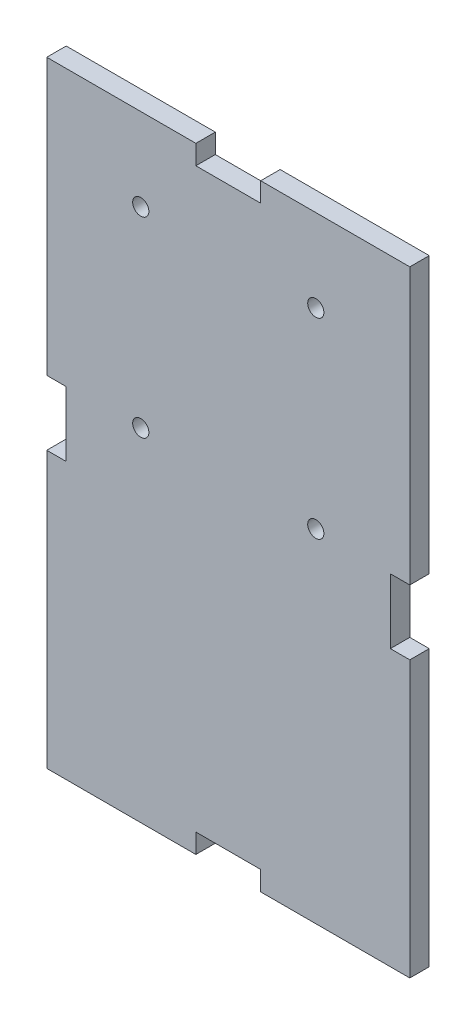
ISO-10303-21;
HEADER;
FILE_DESCRIPTION(('STEP AP214'),'2;1');
FILE_NAME('part.step','',(''),(''),'','','');
FILE_SCHEMA(('AUTOMOTIVE_DESIGN { 1 0 10303 214 1 1 1 1 }'));
ENDSEC;
DATA;
#1=APPLICATION_CONTEXT('core data for automotive mechanical design processes');
#2=APPLICATION_PROTOCOL_DEFINITION('international standard','automotive_design',2000,#1);
#3=PRODUCT_CONTEXT('',#1,'mechanical');
#4=PRODUCT('Part','Part','',(#3));
#5=PRODUCT_RELATED_PRODUCT_CATEGORY('part','',(#4));
#6=PRODUCT_DEFINITION_FORMATION('','',#4);
#7=PRODUCT_DEFINITION_CONTEXT('part definition',#1,'design');
#8=PRODUCT_DEFINITION('design','',#6,#7);
#9=PRODUCT_DEFINITION_SHAPE('','',#8);
#10=(LENGTH_UNIT() NAMED_UNIT(*) SI_UNIT(.MILLI.,.METRE.));
#11=(NAMED_UNIT(*) PLANE_ANGLE_UNIT() SI_UNIT($,.RADIAN.));
#12=(NAMED_UNIT(*) SI_UNIT($,.STERADIAN.) SOLID_ANGLE_UNIT());
#13=UNCERTAINTY_MEASURE_WITH_UNIT(LENGTH_MEASURE(1.E-05),#10,'distance_accuracy_value','');
#14=(GEOMETRIC_REPRESENTATION_CONTEXT(3) GLOBAL_UNCERTAINTY_ASSIGNED_CONTEXT((#13)) GLOBAL_UNIT_ASSIGNED_CONTEXT((#10,
#11,#12)) REPRESENTATION_CONTEXT('',''));
#15=CARTESIAN_POINT('',(0.,0.,0.));
#16=DIRECTION('',(0.,0.,1.));
#17=DIRECTION('',(1.,0.,0.));
#18=AXIS2_PLACEMENT_3D('',#15,#16,#17);
#19=CARTESIAN_POINT('',(-4.87073070123154,46.9601682997695,3.));
#20=DIRECTION('',(-1.,0.,0.));
#21=DIRECTION('',(0.,-1.,0.));
#22=AXIS2_PLACEMENT_3D('',#19,#20,#21);
#23=PLANE('',#22);
#24=DIRECTION('',(0.,1.,0.));
#25=VECTOR('',#24,1.);
#26=CARTESIAN_POINT('',(-4.87073070123154,46.9601682997695,0.));
#27=LINE('',#26,#25);
#28=CARTESIAN_POINT('',(-4.87073070123154,43.9601682997695,0.));
#29=VERTEX_POINT('',#28);
#30=CARTESIAN_POINT('',(-4.87073070123154,46.9601682997695,0.));
#31=VERTEX_POINT('',#30);
#32=EDGE_CURVE('E204',#29,#31,#27,.T.);
#33=ORIENTED_EDGE('',*,*,#32,.T.);
#34=DIRECTION('',(0.,0.,-1.));
#35=VECTOR('',#34,1.);
#36=CARTESIAN_POINT('',(-4.87073070123154,46.9601682997695,3.));
#37=LINE('',#36,#35);
#38=CARTESIAN_POINT('',(-4.87073070123154,46.9601682997695,3.));
#39=VERTEX_POINT('',#38);
#40=EDGE_CURVE('E11',#39,#31,#37,.T.);
#41=ORIENTED_EDGE('',*,*,#40,.F.);
#42=DIRECTION('',(0.,1.,0.));
#43=VECTOR('',#42,1.);
#44=CARTESIAN_POINT('',(-4.87073070123154,46.9601682997695,3.));
#45=LINE('',#44,#43);
#46=CARTESIAN_POINT('',(-4.87073070123154,43.9601682997695,3.));
#47=VERTEX_POINT('',#46);
#48=EDGE_CURVE('E246',#47,#39,#45,.T.);
#49=ORIENTED_EDGE('',*,*,#48,.F.);
#50=DIRECTION('',(0.,0.,-1.));
#51=VECTOR('',#50,1.);
#52=CARTESIAN_POINT('',(-4.87073070123154,43.9601682997695,3.));
#53=LINE('',#52,#51);
#54=EDGE_CURVE('E200',#47,#29,#53,.T.);
#55=ORIENTED_EDGE('',*,*,#54,.T.);
#56=EDGE_LOOP('',(#33,#41,#49,#55));
#57=FACE_BOUND('',#56,.T.);
#58=ADVANCED_FACE('F37',(#57),#23,.F.);
#59=CARTESIAN_POINT('',(-24.8707307012316,46.9601682997696,3.));
#60=DIRECTION('',(0.,-1.,0.));
#61=DIRECTION('',(1.,0.,0.));
#62=AXIS2_PLACEMENT_3D('',#59,#60,#61);
#63=PLANE('',#62);
#64=DIRECTION('',(-1.,0.,0.));
#65=VECTOR('',#64,1.);
#66=CARTESIAN_POINT('',(-24.8707307012316,46.9601682997696,0.));
#67=LINE('',#66,#65);
#68=CARTESIAN_POINT('',(-27.8707307012316,46.9601682997696,0.));
#69=VERTEX_POINT('',#68);
#70=EDGE_CURVE('E207',#31,#69,#67,.T.);
#71=ORIENTED_EDGE('',*,*,#70,.T.);
#72=DIRECTION('',(0.,0.,-1.));
#73=VECTOR('',#72,1.);
#74=CARTESIAN_POINT('',(-27.8707307012316,46.9601682997696,3.));
#75=LINE('',#74,#73);
#76=CARTESIAN_POINT('',(-27.8707307012316,46.9601682997696,3.));
#77=VERTEX_POINT('',#76);
#78=EDGE_CURVE('E45',#77,#69,#75,.T.);
#79=ORIENTED_EDGE('',*,*,#78,.F.);
#80=DIRECTION('',(-1.,0.,0.));
#81=VECTOR('',#80,1.);
#82=CARTESIAN_POINT('',(-24.8707307012316,46.9601682997696,3.));
#83=LINE('',#82,#81);
#84=EDGE_CURVE('E132',#39,#77,#83,.T.);
#85=ORIENTED_EDGE('',*,*,#84,.F.);
#86=ORIENTED_EDGE('',*,*,#40,.T.);
#87=EDGE_LOOP('',(#71,#79,#85,#86));
#88=FACE_BOUND('',#87,.T.);
#89=ADVANCED_FACE('F366',(#88),#63,.F.);
#90=CARTESIAN_POINT('',(-27.8707307012316,46.9601682997696,3.));
#91=DIRECTION('',(1.,0.,0.));
#92=DIRECTION('',(0.,1.,0.));
#93=AXIS2_PLACEMENT_3D('',#90,#91,#92);
#94=PLANE('',#93);
#95=DIRECTION('',(0.,-1.,0.));
#96=VECTOR('',#95,1.);
#97=CARTESIAN_POINT('',(-27.8707307012316,46.9601682997696,0.));
#98=LINE('',#97,#96);
#99=CARTESIAN_POINT('',(-27.8707307012316,4.46016829976955,0.));
#100=VERTEX_POINT('',#99);
#101=EDGE_CURVE('E210',#69,#100,#98,.T.);
#102=ORIENTED_EDGE('',*,*,#101,.T.);
#103=DIRECTION('',(0.,0.,-1.));
#104=VECTOR('',#103,1.);
#105=CARTESIAN_POINT('',(-27.8707307012316,4.46016829976955,3.));
#106=LINE('',#105,#104);
#107=CARTESIAN_POINT('',(-27.8707307012316,4.46016829976955,3.));
#108=VERTEX_POINT('',#107);
#109=EDGE_CURVE('E289',#108,#100,#106,.T.);
#110=ORIENTED_EDGE('',*,*,#109,.F.);
#111=DIRECTION('',(0.,-1.,0.));
#112=VECTOR('',#111,1.);
#113=CARTESIAN_POINT('',(-27.8707307012316,46.9601682997696,3.));
#114=LINE('',#113,#112);
#115=EDGE_CURVE('E297',#77,#108,#114,.T.);
#116=ORIENTED_EDGE('',*,*,#115,.F.);
#117=ORIENTED_EDGE('',*,*,#78,.T.);
#118=EDGE_LOOP('',(#102,#110,#116,#117));
#119=FACE_BOUND('',#118,.T.);
#120=ADVANCED_FACE('F295',(#119),#94,.F.);
#121=CARTESIAN_POINT('',(-24.8707307012316,4.46016829976958,3.));
#122=DIRECTION('',(0.,1.,0.));
#123=DIRECTION('',(-1.,0.,0.));
#124=AXIS2_PLACEMENT_3D('',#121,#122,#123);
#125=PLANE('',#124);
#126=DIRECTION('',(1.,0.,0.));
#127=VECTOR('',#126,1.);
#128=CARTESIAN_POINT('',(-24.8707307012316,4.46016829976958,0.));
#129=LINE('',#128,#127);
#130=CARTESIAN_POINT('',(-24.8707307012316,4.46016829976958,0.));
#131=VERTEX_POINT('',#130);
#132=EDGE_CURVE('E212',#100,#131,#129,.T.);
#133=ORIENTED_EDGE('',*,*,#132,.T.);
#134=DIRECTION('',(0.,0.,-1.));
#135=VECTOR('',#134,1.);
#136=CARTESIAN_POINT('',(-24.8707307012316,4.46016829976958,3.));
#137=LINE('',#136,#135);
#138=CARTESIAN_POINT('',(-24.8707307012316,4.46016829976958,3.));
#139=VERTEX_POINT('',#138);
#140=EDGE_CURVE('E286',#139,#131,#137,.T.);
#141=ORIENTED_EDGE('',*,*,#140,.F.);
#142=DIRECTION('',(1.,0.,0.));
#143=VECTOR('',#142,1.);
#144=CARTESIAN_POINT('',(-24.8707307012316,4.46016829976958,3.));
#145=LINE('',#144,#143);
#146=EDGE_CURVE('E315',#108,#139,#145,.T.);
#147=ORIENTED_EDGE('',*,*,#146,.F.);
#148=ORIENTED_EDGE('',*,*,#109,.T.);
#149=EDGE_LOOP('',(#133,#141,#147,#148));
#150=FACE_BOUND('',#149,.T.);
#151=ADVANCED_FACE('F306',(#150),#125,.F.);
#152=CARTESIAN_POINT('',(-24.8707307012316,4.46016829976958,3.));
#153=DIRECTION('',(1.,0.,0.));
#154=DIRECTION('',(0.,1.,0.));
#155=AXIS2_PLACEMENT_3D('',#152,#153,#154);
#156=PLANE('',#155);
#157=DIRECTION('',(0.,-1.,0.));
#158=VECTOR('',#157,1.);
#159=CARTESIAN_POINT('',(-24.8707307012316,4.46016829976958,0.));
#160=LINE('',#159,#158);
#161=CARTESIAN_POINT('',(-24.8707307012315,-5.53983170023043,0.));
#162=VERTEX_POINT('',#161);
#163=EDGE_CURVE('E214',#131,#162,#160,.T.);
#164=ORIENTED_EDGE('',*,*,#163,.T.);
#165=DIRECTION('',(0.,0.,-1.));
#166=VECTOR('',#165,1.);
#167=CARTESIAN_POINT('',(-24.8707307012315,-5.53983170023043,3.));
#168=LINE('',#167,#166);
#169=CARTESIAN_POINT('',(-24.8707307012315,-5.53983170023043,3.));
#170=VERTEX_POINT('',#169);
#171=EDGE_CURVE('E283',#170,#162,#168,.T.);
#172=ORIENTED_EDGE('',*,*,#171,.F.);
#173=DIRECTION('',(0.,-1.,0.));
#174=VECTOR('',#173,1.);
#175=CARTESIAN_POINT('',(-24.8707307012316,4.46016829976958,3.));
#176=LINE('',#175,#174);
#177=EDGE_CURVE('E312',#139,#170,#176,.T.);
#178=ORIENTED_EDGE('',*,*,#177,.F.);
#179=ORIENTED_EDGE('',*,*,#140,.T.);
#180=EDGE_LOOP('',(#164,#172,#178,#179));
#181=FACE_BOUND('',#180,.T.);
#182=ADVANCED_FACE('F310',(#181),#156,.F.);
#183=CARTESIAN_POINT('',(-24.8707307012315,-5.53983170023043,3.));
#184=DIRECTION('',(0.,-1.,0.));
#185=DIRECTION('',(1.,0.,0.));
#186=AXIS2_PLACEMENT_3D('',#183,#184,#185);
#187=PLANE('',#186);
#188=DIRECTION('',(-1.,0.,0.));
#189=VECTOR('',#188,1.);
#190=CARTESIAN_POINT('',(-24.8707307012315,-5.53983170023043,0.));
#191=LINE('',#190,#189);
#192=CARTESIAN_POINT('',(-27.8707307012315,-5.53983170023042,0.));
#193=VERTEX_POINT('',#192);
#194=EDGE_CURVE('E216',#162,#193,#191,.T.);
#195=ORIENTED_EDGE('',*,*,#194,.T.);
#196=DIRECTION('',(0.,0.,-1.));
#197=VECTOR('',#196,1.);
#198=CARTESIAN_POINT('',(-27.8707307012315,-5.53983170023042,3.));
#199=LINE('',#198,#197);
#200=CARTESIAN_POINT('',(-27.8707307012315,-5.53983170023042,3.));
#201=VERTEX_POINT('',#200);
#202=EDGE_CURVE('E280',#201,#193,#199,.T.);
#203=ORIENTED_EDGE('',*,*,#202,.F.);
#204=DIRECTION('',(-1.,0.,0.));
#205=VECTOR('',#204,1.);
#206=CARTESIAN_POINT('',(-24.8707307012315,-5.53983170023043,3.));
#207=LINE('',#206,#205);
#208=EDGE_CURVE('E314',#170,#201,#207,.T.);
#209=ORIENTED_EDGE('',*,*,#208,.F.);
#210=ORIENTED_EDGE('',*,*,#171,.T.);
#211=EDGE_LOOP('',(#195,#203,#209,#210));
#212=FACE_BOUND('',#211,.T.);
#213=ADVANCED_FACE('F379',(#212),#187,.F.);
#214=CARTESIAN_POINT('',(-27.8707307012315,-5.53983170023042,3.));
#215=DIRECTION('',(1.,0.,0.));
#216=DIRECTION('',(0.,1.,0.));
#217=AXIS2_PLACEMENT_3D('',#214,#215,#216);
#218=PLANE('',#217);
#219=DIRECTION('',(0.,-1.,0.));
#220=VECTOR('',#219,1.);
#221=CARTESIAN_POINT('',(-27.8707307012315,-5.53983170023042,0.));
#222=LINE('',#221,#220);
#223=CARTESIAN_POINT('',(-27.8707307012315,-48.0398317002304,0.));
#224=VERTEX_POINT('',#223);
#225=EDGE_CURVE('E218',#193,#224,#222,.T.);
#226=ORIENTED_EDGE('',*,*,#225,.T.);
#227=DIRECTION('',(0.,0.,-1.));
#228=VECTOR('',#227,1.);
#229=CARTESIAN_POINT('',(-27.8707307012315,-48.0398317002304,3.));
#230=LINE('',#229,#228);
#231=CARTESIAN_POINT('',(-27.8707307012315,-48.0398317002304,3.));
#232=VERTEX_POINT('',#231);
#233=EDGE_CURVE('E277',#232,#224,#230,.T.);
#234=ORIENTED_EDGE('',*,*,#233,.F.);
#235=DIRECTION('',(0.,-1.,0.));
#236=VECTOR('',#235,1.);
#237=CARTESIAN_POINT('',(-27.8707307012315,-5.53983170023042,3.));
#238=LINE('',#237,#236);
#239=EDGE_CURVE('E317',#201,#232,#238,.T.);
#240=ORIENTED_EDGE('',*,*,#239,.F.);
#241=ORIENTED_EDGE('',*,*,#202,.T.);
#242=EDGE_LOOP('',(#226,#234,#240,#241));
#243=FACE_BOUND('',#242,.T.);
#244=ADVANCED_FACE('F382',(#243),#218,.F.);
#245=CARTESIAN_POINT('',(-24.8707307012315,-48.0398317002304,3.));
#246=DIRECTION('',(0.,1.,0.));
#247=DIRECTION('',(-1.,0.,0.));
#248=AXIS2_PLACEMENT_3D('',#245,#246,#247);
#249=PLANE('',#248);
#250=DIRECTION('',(1.,0.,0.));
#251=VECTOR('',#250,1.);
#252=CARTESIAN_POINT('',(-24.8707307012315,-48.0398317002304,0.));
#253=LINE('',#252,#251);
#254=CARTESIAN_POINT('',(-4.87073070123153,-48.0398317002304,0.));
#255=VERTEX_POINT('',#254);
#256=EDGE_CURVE('E221',#224,#255,#253,.T.);
#257=ORIENTED_EDGE('',*,*,#256,.T.);
#258=DIRECTION('',(0.,0.,-1.));
#259=VECTOR('',#258,1.);
#260=CARTESIAN_POINT('',(-4.87073070123153,-48.0398317002304,3.));
#261=LINE('',#260,#259);
#262=CARTESIAN_POINT('',(-4.87073070123153,-48.0398317002304,3.));
#263=VERTEX_POINT('',#262);
#264=EDGE_CURVE('E274',#263,#255,#261,.T.);
#265=ORIENTED_EDGE('',*,*,#264,.F.);
#266=DIRECTION('',(1.,0.,0.));
#267=VECTOR('',#266,1.);
#268=CARTESIAN_POINT('',(-24.8707307012315,-48.0398317002304,3.));
#269=LINE('',#268,#267);
#270=EDGE_CURVE('E323',#232,#263,#269,.T.);
#271=ORIENTED_EDGE('',*,*,#270,.F.);
#272=ORIENTED_EDGE('',*,*,#233,.T.);
#273=EDGE_LOOP('',(#257,#265,#271,#272));
#274=FACE_BOUND('',#273,.T.);
#275=ADVANCED_FACE('F386',(#274),#249,.F.);
#276=CARTESIAN_POINT('',(-4.87073070123153,-45.0398317002304,3.));
#277=DIRECTION('',(-1.,0.,0.));
#278=DIRECTION('',(0.,0.,1.));
#279=AXIS2_PLACEMENT_3D('',#276,#277,#278);
#280=PLANE('',#279);
#281=DIRECTION('',(0.,1.,0.));
#282=VECTOR('',#281,1.);
#283=CARTESIAN_POINT('',(-4.87073070123153,-45.0398317002304,0.));
#284=LINE('',#283,#282);
#285=CARTESIAN_POINT('',(-4.87073070123153,-45.0398317002304,0.));
#286=VERTEX_POINT('',#285);
#287=EDGE_CURVE('E223',#255,#286,#284,.T.);
#288=ORIENTED_EDGE('',*,*,#287,.T.);
#289=DIRECTION('',(0.,0.,-1.));
#290=VECTOR('',#289,1.);
#291=CARTESIAN_POINT('',(-4.87073070123153,-45.0398317002304,3.));
#292=LINE('',#291,#290);
#293=CARTESIAN_POINT('',(-4.87073070123153,-45.0398317002304,3.));
#294=VERTEX_POINT('',#293);
#295=EDGE_CURVE('E271',#294,#286,#292,.T.);
#296=ORIENTED_EDGE('',*,*,#295,.F.);
#297=DIRECTION('',(0.,1.,0.));
#298=VECTOR('',#297,1.);
#299=CARTESIAN_POINT('',(-4.87073070123153,-45.0398317002304,3.));
#300=LINE('',#299,#298);
#301=EDGE_CURVE('E325',#263,#294,#300,.T.);
#302=ORIENTED_EDGE('',*,*,#301,.F.);
#303=ORIENTED_EDGE('',*,*,#264,.T.);
#304=EDGE_LOOP('',(#288,#296,#302,#303));
#305=FACE_BOUND('',#304,.T.);
#306=ADVANCED_FACE('F390',(#305),#280,.F.);
#307=CARTESIAN_POINT('',(-4.87073070123153,-45.0398317002304,3.));
#308=DIRECTION('',(0.,1.,0.));
#309=DIRECTION('',(0.,0.,1.));
#310=AXIS2_PLACEMENT_3D('',#307,#308,#309);
#311=PLANE('',#310);
#312=DIRECTION('',(1.,0.,0.));
#313=VECTOR('',#312,1.);
#314=CARTESIAN_POINT('',(-4.87073070123153,-45.0398317002304,0.));
#315=LINE('',#314,#313);
#316=CARTESIAN_POINT('',(5.12926929876846,-45.0398317002304,0.));
#317=VERTEX_POINT('',#316);
#318=EDGE_CURVE('E225',#286,#317,#315,.T.);
#319=ORIENTED_EDGE('',*,*,#318,.T.);
#320=DIRECTION('',(0.,0.,-1.));
#321=VECTOR('',#320,1.);
#322=CARTESIAN_POINT('',(5.12926929876846,-45.0398317002304,3.));
#323=LINE('',#322,#321);
#324=CARTESIAN_POINT('',(5.12926929876846,-45.0398317002304,3.));
#325=VERTEX_POINT('',#324);
#326=EDGE_CURVE('E268',#325,#317,#323,.T.);
#327=ORIENTED_EDGE('',*,*,#326,.F.);
#328=DIRECTION('',(1.,0.,0.));
#329=VECTOR('',#328,1.);
#330=CARTESIAN_POINT('',(-4.87073070123153,-45.0398317002304,3.));
#331=LINE('',#330,#329);
#332=EDGE_CURVE('E327',#294,#325,#331,.T.);
#333=ORIENTED_EDGE('',*,*,#332,.F.);
#334=ORIENTED_EDGE('',*,*,#295,.T.);
#335=EDGE_LOOP('',(#319,#327,#333,#334));
#336=FACE_BOUND('',#335,.T.);
#337=ADVANCED_FACE('F394',(#336),#311,.F.);
#338=CARTESIAN_POINT('',(5.12926929876846,-45.0398317002304,3.));
#339=DIRECTION('',(1.,0.,0.));
#340=DIRECTION('',(0.,0.,-1.));
#341=AXIS2_PLACEMENT_3D('',#338,#339,#340);
#342=PLANE('',#341);
#343=DIRECTION('',(0.,-1.,0.));
#344=VECTOR('',#343,1.);
#345=CARTESIAN_POINT('',(5.12926929876846,-45.0398317002304,0.));
#346=LINE('',#345,#344);
#347=CARTESIAN_POINT('',(5.12926929876846,-48.0398317002304,0.));
#348=VERTEX_POINT('',#347);
#349=EDGE_CURVE('E227',#317,#348,#346,.T.);
#350=ORIENTED_EDGE('',*,*,#349,.T.);
#351=DIRECTION('',(0.,0.,-1.));
#352=VECTOR('',#351,1.);
#353=CARTESIAN_POINT('',(5.12926929876846,-48.0398317002304,3.));
#354=LINE('',#353,#352);
#355=CARTESIAN_POINT('',(5.12926929876846,-48.0398317002304,3.));
#356=VERTEX_POINT('',#355);
#357=EDGE_CURVE('E265',#356,#348,#354,.T.);
#358=ORIENTED_EDGE('',*,*,#357,.F.);
#359=DIRECTION('',(0.,-1.,0.));
#360=VECTOR('',#359,1.);
#361=CARTESIAN_POINT('',(5.12926929876846,-45.0398317002304,3.));
#362=LINE('',#361,#360);
#363=EDGE_CURVE('E329',#325,#356,#362,.T.);
#364=ORIENTED_EDGE('',*,*,#363,.F.);
#365=ORIENTED_EDGE('',*,*,#326,.T.);
#366=EDGE_LOOP('',(#350,#358,#364,#365));
#367=FACE_BOUND('',#366,.T.);
#368=ADVANCED_FACE('F398',(#367),#342,.F.);
#369=CARTESIAN_POINT('',(25.1292692987685,-48.0398317002304,3.));
#370=DIRECTION('',(0.,1.,0.));
#371=DIRECTION('',(0.,0.,1.));
#372=AXIS2_PLACEMENT_3D('',#369,#370,#371);
#373=PLANE('',#372);
#374=DIRECTION('',(1.,0.,0.));
#375=VECTOR('',#374,1.);
#376=CARTESIAN_POINT('',(25.1292692987685,-48.0398317002304,0.));
#377=LINE('',#376,#375);
#378=CARTESIAN_POINT('',(28.1292692987685,-48.0398317002304,0.));
#379=VERTEX_POINT('',#378);
#380=EDGE_CURVE('E230',#348,#379,#377,.T.);
#381=ORIENTED_EDGE('',*,*,#380,.T.);
#382=DIRECTION('',(0.,0.,-1.));
#383=VECTOR('',#382,1.);
#384=CARTESIAN_POINT('',(28.1292692987685,-48.0398317002304,3.));
#385=LINE('',#384,#383);
#386=CARTESIAN_POINT('',(28.1292692987685,-48.0398317002304,3.));
#387=VERTEX_POINT('',#386);
#388=EDGE_CURVE('E262',#387,#379,#385,.T.);
#389=ORIENTED_EDGE('',*,*,#388,.F.);
#390=DIRECTION('',(1.,0.,0.));
#391=VECTOR('',#390,1.);
#392=CARTESIAN_POINT('',(25.1292692987685,-48.0398317002304,3.));
#393=LINE('',#392,#391);
#394=EDGE_CURVE('E331',#356,#387,#393,.T.);
#395=ORIENTED_EDGE('',*,*,#394,.F.);
#396=ORIENTED_EDGE('',*,*,#357,.T.);
#397=EDGE_LOOP('',(#381,#389,#395,#396));
#398=FACE_BOUND('',#397,.T.);
#399=ADVANCED_FACE('F402',(#398),#373,.F.);
#400=CARTESIAN_POINT('',(28.1292692987685,-5.53983170023041,3.));
#401=DIRECTION('',(-1.,0.,0.));
#402=DIRECTION('',(0.,0.,1.));
#403=AXIS2_PLACEMENT_3D('',#400,#401,#402);
#404=PLANE('',#403);
#405=DIRECTION('',(0.,1.,0.));
#406=VECTOR('',#405,1.);
#407=CARTESIAN_POINT('',(28.1292692987685,-5.53983170023041,0.));
#408=LINE('',#407,#406);
#409=CARTESIAN_POINT('',(28.1292692987685,-5.53983170023041,0.));
#410=VERTEX_POINT('',#409);
#411=EDGE_CURVE('E232',#379,#410,#408,.T.);
#412=ORIENTED_EDGE('',*,*,#411,.T.);
#413=DIRECTION('',(0.,0.,-1.));
#414=VECTOR('',#413,1.);
#415=CARTESIAN_POINT('',(28.1292692987685,-5.53983170023041,3.));
#416=LINE('',#415,#414);
#417=CARTESIAN_POINT('',(28.1292692987685,-5.53983170023041,3.));
#418=VERTEX_POINT('',#417);
#419=EDGE_CURVE('E259',#418,#410,#416,.T.);
#420=ORIENTED_EDGE('',*,*,#419,.F.);
#421=DIRECTION('',(0.,1.,0.));
#422=VECTOR('',#421,1.);
#423=CARTESIAN_POINT('',(28.1292692987685,-5.53983170023041,3.));
#424=LINE('',#423,#422);
#425=EDGE_CURVE('E333',#387,#418,#424,.T.);
#426=ORIENTED_EDGE('',*,*,#425,.F.);
#427=ORIENTED_EDGE('',*,*,#388,.T.);
#428=EDGE_LOOP('',(#412,#420,#426,#427));
#429=FACE_BOUND('',#428,.T.);
#430=ADVANCED_FACE('F406',(#429),#404,.F.);
#431=CARTESIAN_POINT('',(25.1292692987685,-5.53983170023043,3.));
#432=DIRECTION('',(0.,-1.,0.));
#433=DIRECTION('',(1.,0.,0.));
#434=AXIS2_PLACEMENT_3D('',#431,#432,#433);
#435=PLANE('',#434);
#436=DIRECTION('',(-1.,0.,0.));
#437=VECTOR('',#436,1.);
#438=CARTESIAN_POINT('',(25.1292692987685,-5.53983170023043,0.));
#439=LINE('',#438,#437);
#440=CARTESIAN_POINT('',(25.1292692987685,-5.53983170023043,0.));
#441=VERTEX_POINT('',#440);
#442=EDGE_CURVE('E234',#410,#441,#439,.T.);
#443=ORIENTED_EDGE('',*,*,#442,.T.);
#444=DIRECTION('',(0.,0.,-1.));
#445=VECTOR('',#444,1.);
#446=CARTESIAN_POINT('',(25.1292692987685,-5.53983170023043,3.));
#447=LINE('',#446,#445);
#448=CARTESIAN_POINT('',(25.1292692987685,-5.53983170023043,3.));
#449=VERTEX_POINT('',#448);
#450=EDGE_CURVE('E256',#449,#441,#447,.T.);
#451=ORIENTED_EDGE('',*,*,#450,.F.);
#452=DIRECTION('',(-1.,0.,0.));
#453=VECTOR('',#452,1.);
#454=CARTESIAN_POINT('',(25.1292692987685,-5.53983170023043,3.));
#455=LINE('',#454,#453);
#456=EDGE_CURVE('E335',#418,#449,#455,.T.);
#457=ORIENTED_EDGE('',*,*,#456,.F.);
#458=ORIENTED_EDGE('',*,*,#419,.T.);
#459=EDGE_LOOP('',(#443,#451,#457,#458));
#460=FACE_BOUND('',#459,.T.);
#461=ADVANCED_FACE('F410',(#460),#435,.F.);
#462=CARTESIAN_POINT('',(25.1292692987685,4.46016829976958,3.));
#463=DIRECTION('',(-1.,0.,0.));
#464=DIRECTION('',(0.,-1.,0.));
#465=AXIS2_PLACEMENT_3D('',#462,#463,#464);
#466=PLANE('',#465);
#467=DIRECTION('',(0.,1.,0.));
#468=VECTOR('',#467,1.);
#469=CARTESIAN_POINT('',(25.1292692987685,4.46016829976958,0.));
#470=LINE('',#469,#468);
#471=CARTESIAN_POINT('',(25.1292692987685,4.46016829976958,0.));
#472=VERTEX_POINT('',#471);
#473=EDGE_CURVE('E236',#441,#472,#470,.T.);
#474=ORIENTED_EDGE('',*,*,#473,.T.);
#475=DIRECTION('',(0.,0.,-1.));
#476=VECTOR('',#475,1.);
#477=CARTESIAN_POINT('',(25.1292692987685,4.46016829976958,3.));
#478=LINE('',#477,#476);
#479=CARTESIAN_POINT('',(25.1292692987685,4.46016829976958,3.));
#480=VERTEX_POINT('',#479);
#481=EDGE_CURVE('E253',#480,#472,#478,.T.);
#482=ORIENTED_EDGE('',*,*,#481,.F.);
#483=DIRECTION('',(0.,1.,0.));
#484=VECTOR('',#483,1.);
#485=CARTESIAN_POINT('',(25.1292692987685,4.46016829976958,3.));
#486=LINE('',#485,#484);
#487=EDGE_CURVE('E337',#449,#480,#486,.T.);
#488=ORIENTED_EDGE('',*,*,#487,.F.);
#489=ORIENTED_EDGE('',*,*,#450,.T.);
#490=EDGE_LOOP('',(#474,#482,#488,#489));
#491=FACE_BOUND('',#490,.T.);
#492=ADVANCED_FACE('F414',(#491),#466,.F.);
#493=CARTESIAN_POINT('',(25.1292692987685,4.46016829976958,3.));
#494=DIRECTION('',(0.,1.,0.));
#495=DIRECTION('',(-1.,0.,0.));
#496=AXIS2_PLACEMENT_3D('',#493,#494,#495);
#497=PLANE('',#496);
#498=DIRECTION('',(1.,0.,0.));
#499=VECTOR('',#498,1.);
#500=CARTESIAN_POINT('',(25.1292692987685,4.46016829976958,0.));
#501=LINE('',#500,#499);
#502=CARTESIAN_POINT('',(28.1292692987685,4.46016829976957,0.));
#503=VERTEX_POINT('',#502);
#504=EDGE_CURVE('E238',#472,#503,#501,.T.);
#505=ORIENTED_EDGE('',*,*,#504,.T.);
#506=DIRECTION('',(0.,0.,-1.));
#507=VECTOR('',#506,1.);
#508=CARTESIAN_POINT('',(28.1292692987685,4.46016829976957,3.));
#509=LINE('',#508,#507);
#510=CARTESIAN_POINT('',(28.1292692987685,4.46016829976957,3.));
#511=VERTEX_POINT('',#510);
#512=EDGE_CURVE('E250',#511,#503,#509,.T.);
#513=ORIENTED_EDGE('',*,*,#512,.F.);
#514=DIRECTION('',(1.,0.,0.));
#515=VECTOR('',#514,1.);
#516=CARTESIAN_POINT('',(25.1292692987685,4.46016829976958,3.));
#517=LINE('',#516,#515);
#518=EDGE_CURVE('E339',#480,#511,#517,.T.);
#519=ORIENTED_EDGE('',*,*,#518,.F.);
#520=ORIENTED_EDGE('',*,*,#481,.T.);
#521=EDGE_LOOP('',(#505,#513,#519,#520));
#522=FACE_BOUND('',#521,.T.);
#523=ADVANCED_FACE('F345',(#522),#497,.F.);
#524=CARTESIAN_POINT('',(28.1292692987685,46.9601682997696,3.));
#525=DIRECTION('',(-1.,0.,0.));
#526=DIRECTION('',(0.,-1.,0.));
#527=AXIS2_PLACEMENT_3D('',#524,#525,#526);
#528=PLANE('',#527);
#529=DIRECTION('',(0.,1.,0.));
#530=VECTOR('',#529,1.);
#531=CARTESIAN_POINT('',(28.1292692987685,46.9601682997696,0.));
#532=LINE('',#531,#530);
#533=CARTESIAN_POINT('',(28.1292692987685,46.9601682997696,0.));
#534=VERTEX_POINT('',#533);
#535=EDGE_CURVE('E240',#503,#534,#532,.T.);
#536=ORIENTED_EDGE('',*,*,#535,.T.);
#537=DIRECTION('',(0.,0.,-1.));
#538=VECTOR('',#537,1.);
#539=CARTESIAN_POINT('',(28.1292692987685,46.9601682997696,3.));
#540=LINE('',#539,#538);
#541=CARTESIAN_POINT('',(28.1292692987685,46.9601682997696,3.));
#542=VERTEX_POINT('',#541);
#543=EDGE_CURVE('E195',#542,#534,#540,.T.);
#544=ORIENTED_EDGE('',*,*,#543,.F.);
#545=DIRECTION('',(0.,1.,0.));
#546=VECTOR('',#545,1.);
#547=CARTESIAN_POINT('',(28.1292692987685,46.9601682997696,3.));
#548=LINE('',#547,#546);
#549=EDGE_CURVE('E187',#511,#542,#548,.T.);
#550=ORIENTED_EDGE('',*,*,#549,.F.);
#551=ORIENTED_EDGE('',*,*,#512,.T.);
#552=EDGE_LOOP('',(#536,#544,#550,#551));
#553=FACE_BOUND('',#552,.T.);
#554=ADVANCED_FACE('F349',(#553),#528,.F.);
#555=CARTESIAN_POINT('',(25.1292692987685,46.9601682997696,3.));
#556=DIRECTION('',(0.,-1.,0.));
#557=DIRECTION('',(1.,0.,0.));
#558=AXIS2_PLACEMENT_3D('',#555,#556,#557);
#559=PLANE('',#558);
#560=DIRECTION('',(-1.,0.,0.));
#561=VECTOR('',#560,1.);
#562=CARTESIAN_POINT('',(25.1292692987685,46.9601682997696,0.));
#563=LINE('',#562,#561);
#564=CARTESIAN_POINT('',(5.12926929876845,46.9601682997695,0.));
#565=VERTEX_POINT('',#564);
#566=EDGE_CURVE('E194',#534,#565,#563,.T.);
#567=ORIENTED_EDGE('',*,*,#566,.T.);
#568=DIRECTION('',(0.,0.,-1.));
#569=VECTOR('',#568,1.);
#570=CARTESIAN_POINT('',(5.12926929876845,46.9601682997695,3.));
#571=LINE('',#570,#569);
#572=CARTESIAN_POINT('',(5.12926929876845,46.9601682997695,3.));
#573=VERTEX_POINT('',#572);
#574=EDGE_CURVE('E192',#573,#565,#571,.T.);
#575=ORIENTED_EDGE('',*,*,#574,.F.);
#576=DIRECTION('',(-1.,0.,0.));
#577=VECTOR('',#576,1.);
#578=CARTESIAN_POINT('',(25.1292692987685,46.9601682997696,3.));
#579=LINE('',#578,#577);
#580=EDGE_CURVE('E181',#542,#573,#579,.T.);
#581=ORIENTED_EDGE('',*,*,#580,.F.);
#582=ORIENTED_EDGE('',*,*,#543,.T.);
#583=EDGE_LOOP('',(#567,#575,#581,#582));
#584=FACE_BOUND('',#583,.T.);
#585=ADVANCED_FACE('F193',(#584),#559,.F.);
#586=CARTESIAN_POINT('',(5.12926929876845,46.9601682997695,3.));
#587=DIRECTION('',(1.,0.,0.));
#588=DIRECTION('',(0.,1.,0.));
#589=AXIS2_PLACEMENT_3D('',#586,#587,#588);
#590=PLANE('',#589);
#591=DIRECTION('',(0.,-1.,0.));
#592=VECTOR('',#591,1.);
#593=CARTESIAN_POINT('',(5.12926929876845,46.9601682997695,0.));
#594=LINE('',#593,#592);
#595=CARTESIAN_POINT('',(5.12926929876845,43.9601682997695,0.));
#596=VERTEX_POINT('',#595);
#597=EDGE_CURVE('E118',#565,#596,#594,.T.);
#598=ORIENTED_EDGE('',*,*,#597,.T.);
#599=DIRECTION('',(0.,0.,-1.));
#600=VECTOR('',#599,1.);
#601=CARTESIAN_POINT('',(5.12926929876845,43.9601682997695,3.));
#602=LINE('',#601,#600);
#603=CARTESIAN_POINT('',(5.12926929876845,43.9601682997695,3.));
#604=VERTEX_POINT('',#603);
#605=EDGE_CURVE('E196',#604,#596,#602,.T.);
#606=ORIENTED_EDGE('',*,*,#605,.F.);
#607=DIRECTION('',(0.,-1.,0.));
#608=VECTOR('',#607,1.);
#609=CARTESIAN_POINT('',(5.12926929876845,46.9601682997695,3.));
#610=LINE('',#609,#608);
#611=EDGE_CURVE('E185',#573,#604,#610,.T.);
#612=ORIENTED_EDGE('',*,*,#611,.F.);
#613=ORIENTED_EDGE('',*,*,#574,.T.);
#614=EDGE_LOOP('',(#598,#606,#612,#613));
#615=FACE_BOUND('',#614,.T.);
#616=ADVANCED_FACE('F198',(#615),#590,.F.);
#617=CARTESIAN_POINT('',(-4.87073070123154,43.9601682997695,3.));
#618=DIRECTION('',(0.,-1.,0.));
#619=DIRECTION('',(0.,0.,-1.));
#620=AXIS2_PLACEMENT_3D('',#617,#618,#619);
#621=PLANE('',#620);
#622=DIRECTION('',(-1.,0.,0.));
#623=VECTOR('',#622,1.);
#624=CARTESIAN_POINT('',(-4.87073070123154,43.9601682997695,0.));
#625=LINE('',#624,#623);
#626=EDGE_CURVE('E124',#596,#29,#625,.T.);
#627=ORIENTED_EDGE('',*,*,#626,.T.);
#628=ORIENTED_EDGE('',*,*,#54,.F.);
#629=DIRECTION('',(-1.,0.,0.));
#630=VECTOR('',#629,1.);
#631=CARTESIAN_POINT('',(-4.87073070123154,43.9601682997695,3.));
#632=LINE('',#631,#630);
#633=EDGE_CURVE('E53',#604,#47,#632,.T.);
#634=ORIENTED_EDGE('',*,*,#633,.F.);
#635=ORIENTED_EDGE('',*,*,#605,.T.);
#636=EDGE_LOOP('',(#627,#628,#634,#635));
#637=FACE_BOUND('',#636,.T.);
#638=ADVANCED_FACE('F354',(#637),#621,.F.);
#639=CARTESIAN_POINT('',(0.,0.,3.));
#640=DIRECTION('',(0.,0.,1.));
#641=DIRECTION('',(1.,0.,0.));
#642=AXIS2_PLACEMENT_3D('',#639,#640,#641);
#643=PLANE('',#642);
#644=CARTESIAN_POINT('',(13.6292692987684,4.69454329976174,3.));
#645=DIRECTION('',(0.,0.,1.));
#646=DIRECTION('',(1.,0.,0.));
#647=AXIS2_PLACEMENT_3D('',#644,#645,#646);
#648=CIRCLE('',#647,1.25);
#649=CARTESIAN_POINT('',(14.8792692987684,4.69454329976174,3.));
#650=VERTEX_POINT('',#649);
#651=EDGE_CURVE('E662',#650,#650,#648,.T.);
#652=ORIENTED_EDGE('',*,*,#651,.F.);
#653=EDGE_LOOP('',(#652));
#654=FACE_BOUND('',#653,.T.);
#655=CARTESIAN_POINT('',(-13.3707307012316,34.2257932997617,3.));
#656=DIRECTION('',(0.,0.,1.));
#657=DIRECTION('',(1.,0.,0.));
#658=AXIS2_PLACEMENT_3D('',#655,#656,#657);
#659=CIRCLE('',#658,1.25);
#660=CARTESIAN_POINT('',(-12.1207307012316,34.2257932997617,3.));
#661=VERTEX_POINT('',#660);
#662=EDGE_CURVE('E667',#661,#661,#659,.T.);
#663=ORIENTED_EDGE('',*,*,#662,.F.);
#664=EDGE_LOOP('',(#663));
#665=FACE_BOUND('',#664,.T.);
#666=CARTESIAN_POINT('',(-13.3707307012316,4.69454329976172,3.));
#667=DIRECTION('',(0.,0.,1.));
#668=DIRECTION('',(1.,0.,0.));
#669=AXIS2_PLACEMENT_3D('',#666,#667,#668);
#670=CIRCLE('',#669,1.25);
#671=CARTESIAN_POINT('',(-12.1207307012316,4.69454329976172,3.));
#672=VERTEX_POINT('',#671);
#673=EDGE_CURVE('E674',#672,#672,#670,.T.);
#674=ORIENTED_EDGE('',*,*,#673,.F.);
#675=EDGE_LOOP('',(#674));
#676=FACE_BOUND('',#675,.T.);
#677=CARTESIAN_POINT('',(13.6292692987684,34.2257932997617,3.));
#678=DIRECTION('',(0.,0.,1.));
#679=DIRECTION('',(1.,0.,0.));
#680=AXIS2_PLACEMENT_3D('',#677,#678,#679);
#681=CIRCLE('',#680,1.25);
#682=CARTESIAN_POINT('',(14.8792692987684,34.2257932997617,3.));
#683=VERTEX_POINT('',#682);
#684=EDGE_CURVE('E663',#683,#683,#681,.T.);
#685=ORIENTED_EDGE('',*,*,#684,.F.);
#686=EDGE_LOOP('',(#685));
#687=FACE_BOUND('',#686,.T.);
#688=ORIENTED_EDGE('',*,*,#48,.T.);
#689=ORIENTED_EDGE('',*,*,#84,.T.);
#690=ORIENTED_EDGE('',*,*,#115,.T.);
#691=ORIENTED_EDGE('',*,*,#146,.T.);
#692=ORIENTED_EDGE('',*,*,#177,.T.);
#693=ORIENTED_EDGE('',*,*,#208,.T.);
#694=ORIENTED_EDGE('',*,*,#239,.T.);
#695=ORIENTED_EDGE('',*,*,#270,.T.);
#696=ORIENTED_EDGE('',*,*,#301,.T.);
#697=ORIENTED_EDGE('',*,*,#332,.T.);
#698=ORIENTED_EDGE('',*,*,#363,.T.);
#699=ORIENTED_EDGE('',*,*,#394,.T.);
#700=ORIENTED_EDGE('',*,*,#425,.T.);
#701=ORIENTED_EDGE('',*,*,#456,.T.);
#702=ORIENTED_EDGE('',*,*,#487,.T.);
#703=ORIENTED_EDGE('',*,*,#518,.T.);
#704=ORIENTED_EDGE('',*,*,#549,.T.);
#705=ORIENTED_EDGE('',*,*,#580,.T.);
#706=ORIENTED_EDGE('',*,*,#611,.T.);
#707=ORIENTED_EDGE('',*,*,#633,.T.);
#708=EDGE_LOOP('',(#688,#689,#690,#691,#692,#693,#694,#695,#696,#697,#698,#699,#700,#701,#702,
#703,#704,#705,#706,#707));
#709=FACE_BOUND('',#708,.T.);
#710=ADVANCED_FACE('F183',(#654,#665,#676,#687,#709),#643,.T.);
#711=CARTESIAN_POINT('',(0.,0.,0.));
#712=DIRECTION('',(0.,0.,1.));
#713=DIRECTION('',(1.,0.,0.));
#714=AXIS2_PLACEMENT_3D('',#711,#712,#713);
#715=PLANE('',#714);
#716=CARTESIAN_POINT('',(13.6292692987684,4.69454329976174,0.));
#717=DIRECTION('',(0.,0.,1.));
#718=DIRECTION('',(1.,0.,0.));
#719=AXIS2_PLACEMENT_3D('',#716,#717,#718);
#720=CIRCLE('',#719,1.25);
#721=CARTESIAN_POINT('',(14.8792692987684,4.69454329976174,0.));
#722=VERTEX_POINT('',#721);
#723=EDGE_CURVE('E659',#722,#722,#720,.F.);
#724=ORIENTED_EDGE('',*,*,#723,.F.);
#725=EDGE_LOOP('',(#724));
#726=FACE_BOUND('',#725,.T.);
#727=CARTESIAN_POINT('',(-13.3707307012316,34.2257932997617,0.));
#728=DIRECTION('',(0.,0.,1.));
#729=DIRECTION('',(1.,0.,0.));
#730=AXIS2_PLACEMENT_3D('',#727,#728,#729);
#731=CIRCLE('',#730,1.25);
#732=CARTESIAN_POINT('',(-12.1207307012316,34.2257932997617,0.));
#733=VERTEX_POINT('',#732);
#734=EDGE_CURVE('E671',#733,#733,#731,.F.);
#735=ORIENTED_EDGE('',*,*,#734,.F.);
#736=EDGE_LOOP('',(#735));
#737=FACE_BOUND('',#736,.T.);
#738=CARTESIAN_POINT('',(-13.3707307012316,4.69454329976172,0.));
#739=DIRECTION('',(0.,0.,1.));
#740=DIRECTION('',(1.,0.,0.));
#741=AXIS2_PLACEMENT_3D('',#738,#739,#740);
#742=CIRCLE('',#741,1.25);
#743=CARTESIAN_POINT('',(-12.1207307012316,4.69454329976172,0.));
#744=VERTEX_POINT('',#743);
#745=EDGE_CURVE('E692',#744,#744,#742,.F.);
#746=ORIENTED_EDGE('',*,*,#745,.F.);
#747=EDGE_LOOP('',(#746));
#748=FACE_BOUND('',#747,.T.);
#749=CARTESIAN_POINT('',(13.6292692987684,34.2257932997617,0.));
#750=DIRECTION('',(0.,0.,1.));
#751=DIRECTION('',(1.,0.,0.));
#752=AXIS2_PLACEMENT_3D('',#749,#750,#751);
#753=CIRCLE('',#752,1.25);
#754=CARTESIAN_POINT('',(14.8792692987684,34.2257932997617,0.));
#755=VERTEX_POINT('',#754);
#756=EDGE_CURVE('E208',#755,#755,#753,.F.);
#757=ORIENTED_EDGE('',*,*,#756,.F.);
#758=EDGE_LOOP('',(#757));
#759=FACE_BOUND('',#758,.T.);
#760=ORIENTED_EDGE('',*,*,#32,.F.);
#761=ORIENTED_EDGE('',*,*,#626,.F.);
#762=ORIENTED_EDGE('',*,*,#597,.F.);
#763=ORIENTED_EDGE('',*,*,#566,.F.);
#764=ORIENTED_EDGE('',*,*,#535,.F.);
#765=ORIENTED_EDGE('',*,*,#504,.F.);
#766=ORIENTED_EDGE('',*,*,#473,.F.);
#767=ORIENTED_EDGE('',*,*,#442,.F.);
#768=ORIENTED_EDGE('',*,*,#411,.F.);
#769=ORIENTED_EDGE('',*,*,#380,.F.);
#770=ORIENTED_EDGE('',*,*,#349,.F.);
#771=ORIENTED_EDGE('',*,*,#318,.F.);
#772=ORIENTED_EDGE('',*,*,#287,.F.);
#773=ORIENTED_EDGE('',*,*,#256,.F.);
#774=ORIENTED_EDGE('',*,*,#225,.F.);
#775=ORIENTED_EDGE('',*,*,#194,.F.);
#776=ORIENTED_EDGE('',*,*,#163,.F.);
#777=ORIENTED_EDGE('',*,*,#132,.F.);
#778=ORIENTED_EDGE('',*,*,#101,.F.);
#779=ORIENTED_EDGE('',*,*,#70,.F.);
#780=EDGE_LOOP('',(#760,#761,#762,#763,#764,#765,#766,#767,#768,#769,#770,#771,#772,#773,#774,
#775,#776,#777,#778,#779));
#781=FACE_BOUND('',#780,.T.);
#782=ADVANCED_FACE('F301',(#726,#737,#748,#759,#781),#715,.F.);
#783=CARTESIAN_POINT('',(13.6292692987684,34.2257932997617,-3.53553390593274));
#784=DIRECTION('',(0.,0.,1.));
#785=DIRECTION('',(1.,0.,0.));
#786=AXIS2_PLACEMENT_3D('',#783,#784,#785);
#787=CYLINDRICAL_SURFACE('',#786,1.25);
#788=ORIENTED_EDGE('',*,*,#756,.T.);
#789=EDGE_LOOP('',(#788));
#790=FACE_BOUND('',#789,.T.);
#791=ORIENTED_EDGE('',*,*,#684,.T.);
#792=EDGE_LOOP('',(#791));
#793=FACE_BOUND('',#792,.T.);
#794=ADVANCED_FACE('F454',(#790,#793),#787,.F.);
#795=CARTESIAN_POINT('',(-13.3707307012316,4.69454329976172,-3.53553390593274));
#796=DIRECTION('',(0.,0.,1.));
#797=DIRECTION('',(1.,0.,0.));
#798=AXIS2_PLACEMENT_3D('',#795,#796,#797);
#799=CYLINDRICAL_SURFACE('',#798,1.25);
#800=ORIENTED_EDGE('',*,*,#745,.T.);
#801=EDGE_LOOP('',(#800));
#802=FACE_BOUND('',#801,.T.);
#803=ORIENTED_EDGE('',*,*,#673,.T.);
#804=EDGE_LOOP('',(#803));
#805=FACE_BOUND('',#804,.T.);
#806=ADVANCED_FACE('F464',(#802,#805),#799,.F.);
#807=CARTESIAN_POINT('',(-13.3707307012316,34.2257932997617,-3.53553390593274));
#808=DIRECTION('',(0.,0.,1.));
#809=DIRECTION('',(1.,0.,0.));
#810=AXIS2_PLACEMENT_3D('',#807,#808,#809);
#811=CYLINDRICAL_SURFACE('',#810,1.25);
#812=ORIENTED_EDGE('',*,*,#734,.T.);
#813=EDGE_LOOP('',(#812));
#814=FACE_BOUND('',#813,.T.);
#815=ORIENTED_EDGE('',*,*,#662,.T.);
#816=EDGE_LOOP('',(#815));
#817=FACE_BOUND('',#816,.T.);
#818=ADVANCED_FACE('F475',(#814,#817),#811,.F.);
#819=CARTESIAN_POINT('',(13.6292692987684,4.69454329976174,-3.53553390593274));
#820=DIRECTION('',(0.,0.,1.));
#821=DIRECTION('',(1.,0.,0.));
#822=AXIS2_PLACEMENT_3D('',#819,#820,#821);
#823=CYLINDRICAL_SURFACE('',#822,1.25);
#824=ORIENTED_EDGE('',*,*,#723,.T.);
#825=EDGE_LOOP('',(#824));
#826=FACE_BOUND('',#825,.T.);
#827=ORIENTED_EDGE('',*,*,#651,.T.);
#828=EDGE_LOOP('',(#827));
#829=FACE_BOUND('',#828,.T.);
#830=ADVANCED_FACE('F486',(#826,#829),#823,.F.);
#831=CLOSED_SHELL('',(#58,#89,#120,#151,#182,#213,#244,#275,#306,#337,#368,#399,#430,#461,#492,
#523,#554,#585,#616,#638,#710,#782,#794,#806,#818,#830));
#832=MANIFOLD_SOLID_BREP('B2',#831);
#833=ADVANCED_BREP_SHAPE_REPRESENTATION('',(#18,#832),#14);
#834=SHAPE_DEFINITION_REPRESENTATION(#9,#833);
ENDSEC;
END-ISO-10303-21;
